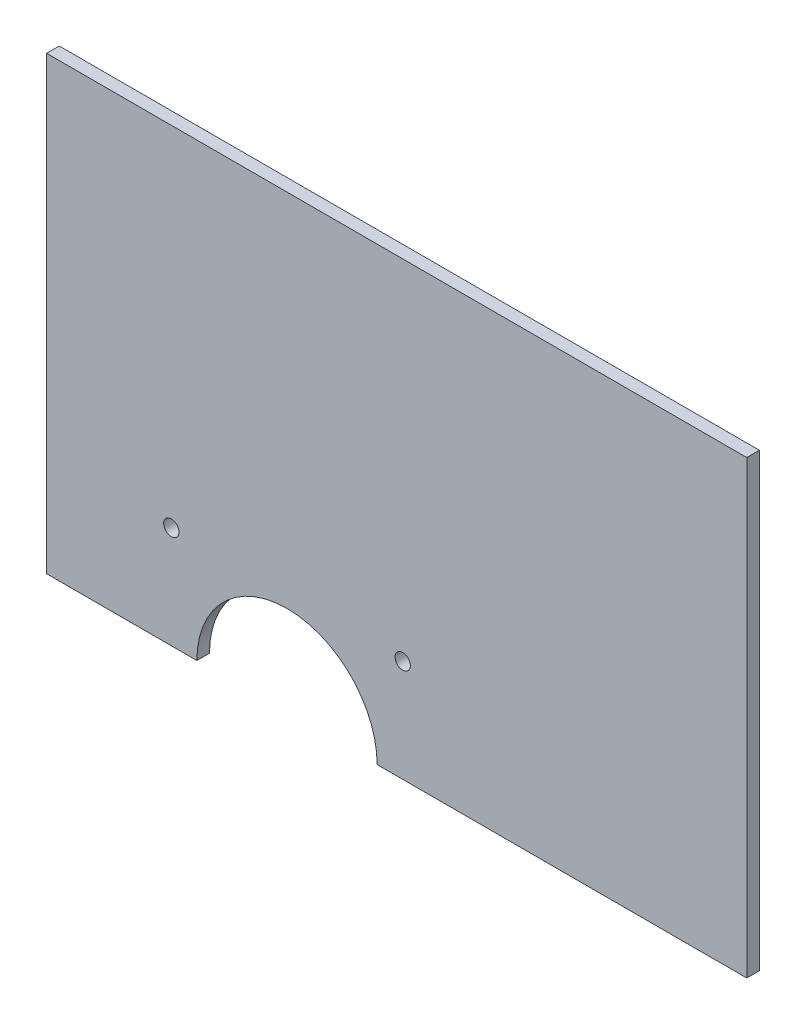
ISO-10303-21;
HEADER;
FILE_DESCRIPTION(('STEP AP214'),'2;1');
FILE_NAME('part.step','',(''),(''),'','','');
FILE_SCHEMA(('AUTOMOTIVE_DESIGN { 1 0 10303 214 1 1 1 1 }'));
ENDSEC;
DATA;
#1=APPLICATION_CONTEXT('core data for automotive mechanical design processes');
#2=APPLICATION_PROTOCOL_DEFINITION('international standard','automotive_design',2000,#1);
#3=PRODUCT_CONTEXT('',#1,'mechanical');
#4=PRODUCT('Part','Part','',(#3));
#5=PRODUCT_RELATED_PRODUCT_CATEGORY('part','',(#4));
#6=PRODUCT_DEFINITION_FORMATION('','',#4);
#7=PRODUCT_DEFINITION_CONTEXT('part definition',#1,'design');
#8=PRODUCT_DEFINITION('design','',#6,#7);
#9=PRODUCT_DEFINITION_SHAPE('','',#8);
#10=(LENGTH_UNIT() NAMED_UNIT(*) SI_UNIT(.MILLI.,.METRE.));
#11=(NAMED_UNIT(*) PLANE_ANGLE_UNIT() SI_UNIT($,.RADIAN.));
#12=(NAMED_UNIT(*) SI_UNIT($,.STERADIAN.) SOLID_ANGLE_UNIT());
#13=UNCERTAINTY_MEASURE_WITH_UNIT(LENGTH_MEASURE(1.E-05),#10,'distance_accuracy_value','');
#14=(GEOMETRIC_REPRESENTATION_CONTEXT(3) GLOBAL_UNCERTAINTY_ASSIGNED_CONTEXT((#13)) GLOBAL_UNIT_ASSIGNED_CONTEXT((#10,
#11,#12)) REPRESENTATION_CONTEXT('',''));
#15=CARTESIAN_POINT('',(0.,0.,0.));
#16=DIRECTION('',(0.,0.,1.));
#17=DIRECTION('',(1.,0.,0.));
#18=AXIS2_PLACEMENT_3D('',#15,#16,#17);
#19=CARTESIAN_POINT('',(-119.563037439145,-81.2676537585421,4.2));
#20=DIRECTION('',(0.,1.,0.));
#21=DIRECTION('',(0.,0.,1.));
#22=AXIS2_PLACEMENT_3D('',#19,#20,#21);
#23=PLANE('',#22);
#24=DIRECTION('',(1.,0.,0.));
#25=VECTOR('',#24,1.);
#26=CARTESIAN_POINT('',(-119.563037439145,-81.2676537585421,0.));
#27=LINE('',#26,#25);
#28=CARTESIAN_POINT('',(-119.563037439145,-81.2676537585421,0.));
#29=VERTEX_POINT('',#28);
#30=CARTESIAN_POINT('',(-69.5630374391454,-81.2676537585421,0.));
#31=VERTEX_POINT('',#30);
#32=EDGE_CURVE('E123',#29,#31,#27,.T.);
#33=ORIENTED_EDGE('',*,*,#32,.T.);
#34=DIRECTION('',(0.,0.,1.));
#35=VECTOR('',#34,1.);
#36=CARTESIAN_POINT('',(-69.5630374391454,-81.2676537585421,0.));
#37=LINE('',#36,#35);
#38=CARTESIAN_POINT('',(-69.5630374391454,-81.2676537585421,4.2));
#39=VERTEX_POINT('',#38);
#40=EDGE_CURVE('E54',#31,#39,#37,.T.);
#41=ORIENTED_EDGE('',*,*,#40,.T.);
#42=DIRECTION('',(1.,0.,0.));
#43=VECTOR('',#42,1.);
#44=CARTESIAN_POINT('',(-119.563037439145,-81.2676537585421,4.2));
#45=LINE('',#44,#43);
#46=CARTESIAN_POINT('',(-119.563037439145,-81.2676537585421,4.2));
#47=VERTEX_POINT('',#46);
#48=EDGE_CURVE('E90',#47,#39,#45,.T.);
#49=ORIENTED_EDGE('',*,*,#48,.F.);
#50=DIRECTION('',(0.,0.,-1.));
#51=VECTOR('',#50,1.);
#52=CARTESIAN_POINT('',(-119.563037439145,-81.2676537585421,4.2));
#53=LINE('',#52,#51);
#54=EDGE_CURVE('E11',#47,#29,#53,.T.);
#55=ORIENTED_EDGE('',*,*,#54,.T.);
#56=EDGE_LOOP('',(#33,#41,#49,#55));
#57=FACE_BOUND('',#56,.T.);
#58=ADVANCED_FACE('F38',(#57),#23,.F.);
#59=CARTESIAN_POINT('',(-119.563037439145,68.7323462414579,4.2));
#60=DIRECTION('',(1.,0.,0.));
#61=DIRECTION('',(0.,0.,-1.));
#62=AXIS2_PLACEMENT_3D('',#59,#60,#61);
#63=PLANE('',#62);
#64=DIRECTION('',(0.,-1.,0.));
#65=VECTOR('',#64,1.);
#66=CARTESIAN_POINT('',(-119.563037439145,68.7323462414579,0.));
#67=LINE('',#66,#65);
#68=CARTESIAN_POINT('',(-119.563037439145,68.7323462414579,0.));
#69=VERTEX_POINT('',#68);
#70=EDGE_CURVE('E124',#69,#29,#67,.T.);
#71=ORIENTED_EDGE('',*,*,#70,.T.);
#72=ORIENTED_EDGE('',*,*,#54,.F.);
#73=DIRECTION('',(0.,-1.,0.));
#74=VECTOR('',#73,1.);
#75=CARTESIAN_POINT('',(-119.563037439145,68.7323462414579,4.2));
#76=LINE('',#75,#74);
#77=CARTESIAN_POINT('',(-119.563037439145,68.7323462414579,4.2));
#78=VERTEX_POINT('',#77);
#79=EDGE_CURVE('E137',#78,#47,#76,.T.);
#80=ORIENTED_EDGE('',*,*,#79,.F.);
#81=DIRECTION('',(0.,0.,-1.));
#82=VECTOR('',#81,1.);
#83=CARTESIAN_POINT('',(-119.563037439145,68.7323462414579,4.2));
#84=LINE('',#83,#82);
#85=EDGE_CURVE('E138',#78,#69,#84,.T.);
#86=ORIENTED_EDGE('',*,*,#85,.T.);
#87=EDGE_LOOP('',(#71,#72,#80,#86));
#88=FACE_BOUND('',#87,.T.);
#89=ADVANCED_FACE('F40',(#88),#63,.F.);
#90=CARTESIAN_POINT('',(-9.56303743914541,-81.2676537585421,4.2));
#91=VERTEX_POINT('',#90);
#92=CARTESIAN_POINT('',(113.436962560855,-81.2676537585421,4.2));
#93=VERTEX_POINT('',#92);
#94=EDGE_CURVE('E115',#91,#93,#45,.T.);
#95=ORIENTED_EDGE('',*,*,#94,.F.);
#96=DIRECTION('',(0.,0.,1.));
#97=VECTOR('',#96,1.);
#98=CARTESIAN_POINT('',(-9.56303743914541,-81.2676537585421,0.));
#99=LINE('',#98,#97);
#100=CARTESIAN_POINT('',(-9.56303743914541,-81.2676537585421,0.));
#101=VERTEX_POINT('',#100);
#102=EDGE_CURVE('E101',#101,#91,#99,.T.);
#103=ORIENTED_EDGE('',*,*,#102,.F.);
#104=CARTESIAN_POINT('',(113.436962560855,-81.2676537585421,0.));
#105=VERTEX_POINT('',#104);
#106=EDGE_CURVE('E113',#101,#105,#27,.T.);
#107=ORIENTED_EDGE('',*,*,#106,.T.);
#108=DIRECTION('',(0.,0.,-1.));
#109=VECTOR('',#108,1.);
#110=CARTESIAN_POINT('',(113.436962560855,-81.2676537585421,4.2));
#111=LINE('',#110,#109);
#112=EDGE_CURVE('E47',#93,#105,#111,.T.);
#113=ORIENTED_EDGE('',*,*,#112,.F.);
#114=EDGE_LOOP('',(#95,#103,#107,#113));
#115=FACE_BOUND('',#114,.T.);
#116=ADVANCED_FACE('F111',(#115),#23,.F.);
#117=CARTESIAN_POINT('',(113.436962560855,68.7323462414579,4.2));
#118=DIRECTION('',(-1.,0.,0.));
#119=DIRECTION('',(0.,-1.,0.));
#120=AXIS2_PLACEMENT_3D('',#117,#118,#119);
#121=PLANE('',#120);
#122=DIRECTION('',(0.,1.,0.));
#123=VECTOR('',#122,1.);
#124=CARTESIAN_POINT('',(113.436962560855,68.7323462414579,0.));
#125=LINE('',#124,#123);
#126=CARTESIAN_POINT('',(113.436962560855,68.7323462414579,0.));
#127=VERTEX_POINT('',#126);
#128=EDGE_CURVE('E121',#105,#127,#125,.T.);
#129=ORIENTED_EDGE('',*,*,#128,.T.);
#130=DIRECTION('',(0.,0.,-1.));
#131=VECTOR('',#130,1.);
#132=CARTESIAN_POINT('',(113.436962560855,68.7323462414579,4.2));
#133=LINE('',#132,#131);
#134=CARTESIAN_POINT('',(113.436962560855,68.7323462414579,4.2));
#135=VERTEX_POINT('',#134);
#136=EDGE_CURVE('E141',#135,#127,#133,.T.);
#137=ORIENTED_EDGE('',*,*,#136,.F.);
#138=DIRECTION('',(0.,1.,0.));
#139=VECTOR('',#138,1.);
#140=CARTESIAN_POINT('',(113.436962560855,68.7323462414579,4.2));
#141=LINE('',#140,#139);
#142=EDGE_CURVE('E148',#93,#135,#141,.T.);
#143=ORIENTED_EDGE('',*,*,#142,.F.);
#144=ORIENTED_EDGE('',*,*,#112,.T.);
#145=EDGE_LOOP('',(#129,#137,#143,#144));
#146=FACE_BOUND('',#145,.T.);
#147=ADVANCED_FACE('F146',(#146),#121,.F.);
#148=CARTESIAN_POINT('',(-119.563037439145,68.7323462414579,4.2));
#149=DIRECTION('',(0.,-1.,0.));
#150=DIRECTION('',(0.,0.,-1.));
#151=AXIS2_PLACEMENT_3D('',#148,#149,#150);
#152=PLANE('',#151);
#153=DIRECTION('',(-1.,0.,0.));
#154=VECTOR('',#153,1.);
#155=CARTESIAN_POINT('',(-119.563037439145,68.7323462414579,0.));
#156=LINE('',#155,#154);
#157=EDGE_CURVE('E84',#127,#69,#156,.T.);
#158=ORIENTED_EDGE('',*,*,#157,.T.);
#159=ORIENTED_EDGE('',*,*,#85,.F.);
#160=DIRECTION('',(-1.,0.,0.));
#161=VECTOR('',#160,1.);
#162=CARTESIAN_POINT('',(-119.563037439145,68.7323462414579,4.2));
#163=LINE('',#162,#161);
#164=EDGE_CURVE('E63',#135,#78,#163,.T.);
#165=ORIENTED_EDGE('',*,*,#164,.F.);
#166=ORIENTED_EDGE('',*,*,#136,.T.);
#167=EDGE_LOOP('',(#158,#159,#165,#166));
#168=FACE_BOUND('',#167,.T.);
#169=ADVANCED_FACE('F188',(#168),#152,.F.);
#170=CARTESIAN_POINT('',(0.,0.,4.2));
#171=DIRECTION('',(0.,0.,1.));
#172=DIRECTION('',(1.,0.,0.));
#173=AXIS2_PLACEMENT_3D('',#170,#171,#172);
#174=PLANE('',#173);
#175=CARTESIAN_POINT('',(-78.0630374391454,-47.2676537585421,4.2));
#176=DIRECTION('',(0.,0.,1.));
#177=DIRECTION('',(1.,0.,0.));
#178=AXIS2_PLACEMENT_3D('',#175,#176,#177);
#179=CIRCLE('',#178,2.54999999999999);
#180=CARTESIAN_POINT('',(-75.5130374391454,-47.2676537585421,4.2));
#181=VERTEX_POINT('',#180);
#182=EDGE_CURVE('E168',#181,#181,#179,.T.);
#183=ORIENTED_EDGE('',*,*,#182,.F.);
#184=EDGE_LOOP('',(#183));
#185=FACE_BOUND('',#184,.T.);
#186=CARTESIAN_POINT('',(-1.06303743914542,-47.2676537585421,4.2));
#187=DIRECTION('',(0.,0.,1.));
#188=DIRECTION('',(1.,0.,0.));
#189=AXIS2_PLACEMENT_3D('',#186,#187,#188);
#190=CIRCLE('',#189,2.55);
#191=CARTESIAN_POINT('',(1.48696256085459,-47.2676537585421,4.2));
#192=VERTEX_POINT('',#191);
#193=EDGE_CURVE('E117',#192,#192,#190,.T.);
#194=ORIENTED_EDGE('',*,*,#193,.F.);
#195=EDGE_LOOP('',(#194));
#196=FACE_BOUND('',#195,.T.);
#197=CARTESIAN_POINT('',(-39.5630374391454,-81.2676537585421,4.2));
#198=DIRECTION('',(0.,0.,1.));
#199=DIRECTION('',(-1.,0.,0.));
#200=AXIS2_PLACEMENT_3D('',#197,#198,#199);
#201=CIRCLE('',#200,30.);
#202=EDGE_CURVE('E107',#91,#39,#201,.T.);
#203=ORIENTED_EDGE('',*,*,#202,.F.);
#204=ORIENTED_EDGE('',*,*,#94,.T.);
#205=ORIENTED_EDGE('',*,*,#142,.T.);
#206=ORIENTED_EDGE('',*,*,#164,.T.);
#207=ORIENTED_EDGE('',*,*,#79,.T.);
#208=ORIENTED_EDGE('',*,*,#48,.T.);
#209=EDGE_LOOP('',(#203,#204,#205,#206,#207,#208));
#210=FACE_BOUND('',#209,.T.);
#211=ADVANCED_FACE('F185',(#185,#196,#210),#174,.T.);
#212=CARTESIAN_POINT('',(0.,0.,0.));
#213=DIRECTION('',(0.,0.,1.));
#214=DIRECTION('',(1.,0.,0.));
#215=AXIS2_PLACEMENT_3D('',#212,#213,#214);
#216=PLANE('',#215);
#217=CARTESIAN_POINT('',(-78.0630374391454,-47.2676537585421,0.));
#218=DIRECTION('',(0.,0.,1.));
#219=DIRECTION('',(1.,0.,0.));
#220=AXIS2_PLACEMENT_3D('',#217,#218,#219);
#221=CIRCLE('',#220,2.54999999999999);
#222=CARTESIAN_POINT('',(-75.5130374391454,-47.2676537585421,0.));
#223=VERTEX_POINT('',#222);
#224=EDGE_CURVE('E129',#223,#223,#221,.T.);
#225=ORIENTED_EDGE('',*,*,#224,.T.);
#226=EDGE_LOOP('',(#225));
#227=FACE_BOUND('',#226,.T.);
#228=CARTESIAN_POINT('',(-1.06303743914542,-47.2676537585421,0.));
#229=DIRECTION('',(0.,0.,1.));
#230=DIRECTION('',(1.,0.,0.));
#231=AXIS2_PLACEMENT_3D('',#228,#229,#230);
#232=CIRCLE('',#231,2.55);
#233=CARTESIAN_POINT('',(1.48696256085459,-47.2676537585421,0.));
#234=VERTEX_POINT('',#233);
#235=EDGE_CURVE('E164',#234,#234,#232,.T.);
#236=ORIENTED_EDGE('',*,*,#235,.T.);
#237=EDGE_LOOP('',(#236));
#238=FACE_BOUND('',#237,.T.);
#239=ORIENTED_EDGE('',*,*,#106,.F.);
#240=CARTESIAN_POINT('',(-39.5630374391454,-81.2676537585421,0.));
#241=DIRECTION('',(0.,0.,1.));
#242=DIRECTION('',(-1.,0.,0.));
#243=AXIS2_PLACEMENT_3D('',#240,#241,#242);
#244=CIRCLE('',#243,30.);
#245=EDGE_CURVE('E98',#101,#31,#244,.T.);
#246=ORIENTED_EDGE('',*,*,#245,.T.);
#247=ORIENTED_EDGE('',*,*,#32,.F.);
#248=ORIENTED_EDGE('',*,*,#70,.F.);
#249=ORIENTED_EDGE('',*,*,#157,.F.);
#250=ORIENTED_EDGE('',*,*,#128,.F.);
#251=EDGE_LOOP('',(#239,#246,#247,#248,#249,#250));
#252=FACE_BOUND('',#251,.T.);
#253=ADVANCED_FACE('F120',(#227,#238,#252),#216,.F.);
#254=CARTESIAN_POINT('',(-39.5630374391454,-81.2676537585421,0.));
#255=DIRECTION('',(0.,0.,1.));
#256=DIRECTION('',(1.,0.,0.));
#257=AXIS2_PLACEMENT_3D('',#254,#255,#256);
#258=CYLINDRICAL_SURFACE('',#257,30.);
#259=ORIENTED_EDGE('',*,*,#202,.T.);
#260=ORIENTED_EDGE('',*,*,#40,.F.);
#261=ORIENTED_EDGE('',*,*,#245,.F.);
#262=ORIENTED_EDGE('',*,*,#102,.T.);
#263=EDGE_LOOP('',(#259,#260,#261,#262));
#264=FACE_BOUND('',#263,.T.);
#265=ADVANCED_FACE('F100',(#264),#258,.F.);
#266=CARTESIAN_POINT('',(-1.06303743914542,-47.2676537585421,0.));
#267=DIRECTION('',(0.,0.,1.));
#268=DIRECTION('',(1.,0.,0.));
#269=AXIS2_PLACEMENT_3D('',#266,#267,#268);
#270=CYLINDRICAL_SURFACE('',#269,2.55);
#271=ORIENTED_EDGE('',*,*,#235,.F.);
#272=EDGE_LOOP('',(#271));
#273=FACE_BOUND('',#272,.T.);
#274=ORIENTED_EDGE('',*,*,#193,.T.);
#275=EDGE_LOOP('',(#274));
#276=FACE_BOUND('',#275,.T.);
#277=ADVANCED_FACE('F181',(#273,#276),#270,.F.);
#278=CARTESIAN_POINT('',(-78.0630374391454,-47.2676537585421,0.));
#279=DIRECTION('',(0.,0.,1.));
#280=DIRECTION('',(1.,0.,0.));
#281=AXIS2_PLACEMENT_3D('',#278,#279,#280);
#282=CYLINDRICAL_SURFACE('',#281,2.54999999999999);
#283=ORIENTED_EDGE('',*,*,#224,.F.);
#284=EDGE_LOOP('',(#283));
#285=FACE_BOUND('',#284,.T.);
#286=ORIENTED_EDGE('',*,*,#182,.T.);
#287=EDGE_LOOP('',(#286));
#288=FACE_BOUND('',#287,.T.);
#289=ADVANCED_FACE('F178',(#285,#288),#282,.F.);
#290=CLOSED_SHELL('',(#58,#89,#116,#147,#169,#211,#253,#265,#277,#289));
#291=MANIFOLD_SOLID_BREP('B2',#290);
#292=ADVANCED_BREP_SHAPE_REPRESENTATION('',(#18,#291),#14);
#293=SHAPE_DEFINITION_REPRESENTATION(#9,#292);
ENDSEC;
END-ISO-10303-21;
